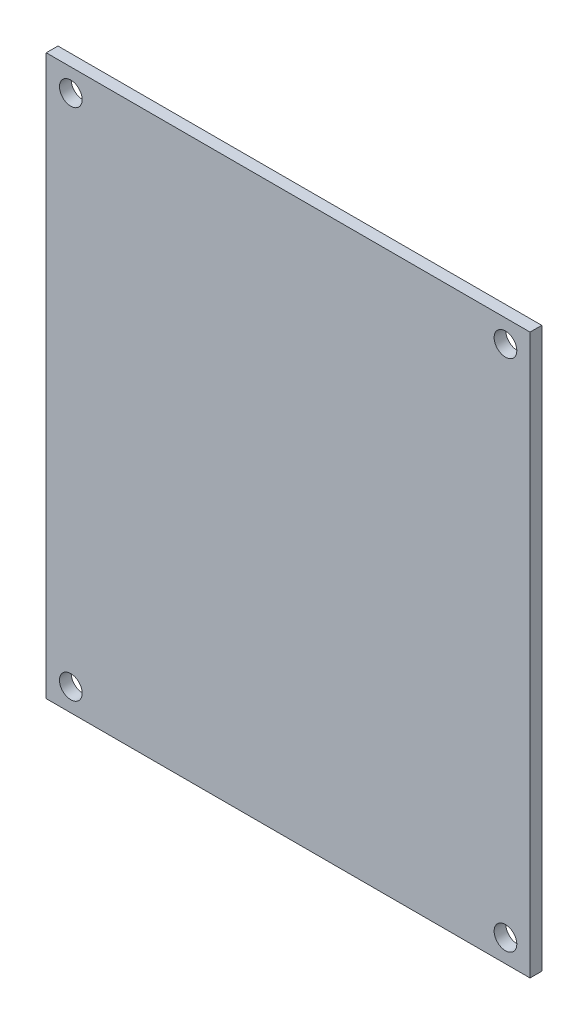
ISO-10303-21;
HEADER;
FILE_DESCRIPTION(('STEP AP214'),'2;1');
FILE_NAME('part.step','',(''),(''),'','','');
FILE_SCHEMA(('AUTOMOTIVE_DESIGN { 1 0 10303 214 1 1 1 1 }'));
ENDSEC;
DATA;
#1=APPLICATION_CONTEXT('core data for automotive mechanical design processes');
#2=APPLICATION_PROTOCOL_DEFINITION('international standard','automotive_design',2000,#1);
#3=PRODUCT_CONTEXT('',#1,'mechanical');
#4=PRODUCT('Part','Part','',(#3));
#5=PRODUCT_RELATED_PRODUCT_CATEGORY('part','',(#4));
#6=PRODUCT_DEFINITION_FORMATION('','',#4);
#7=PRODUCT_DEFINITION_CONTEXT('part definition',#1,'design');
#8=PRODUCT_DEFINITION('design','',#6,#7);
#9=PRODUCT_DEFINITION_SHAPE('','',#8);
#10=(LENGTH_UNIT() NAMED_UNIT(*) SI_UNIT(.MILLI.,.METRE.));
#11=(NAMED_UNIT(*) PLANE_ANGLE_UNIT() SI_UNIT($,.RADIAN.));
#12=(NAMED_UNIT(*) SI_UNIT($,.STERADIAN.) SOLID_ANGLE_UNIT());
#13=UNCERTAINTY_MEASURE_WITH_UNIT(LENGTH_MEASURE(1.E-05),#10,'distance_accuracy_value','');
#14=(GEOMETRIC_REPRESENTATION_CONTEXT(3) GLOBAL_UNCERTAINTY_ASSIGNED_CONTEXT((#13)) GLOBAL_UNIT_ASSIGNED_CONTEXT((#10,
#11,#12)) REPRESENTATION_CONTEXT('',''));
#15=CARTESIAN_POINT('',(0.,0.,0.));
#16=DIRECTION('',(0.,0.,1.));
#17=DIRECTION('',(1.,0.,0.));
#18=AXIS2_PLACEMENT_3D('',#15,#16,#17);
#19=CARTESIAN_POINT('',(32.,-37.,1.55));
#20=DIRECTION('',(-1.,0.,0.));
#21=DIRECTION('',(0.,0.,1.));
#22=AXIS2_PLACEMENT_3D('',#19,#20,#21);
#23=PLANE('',#22);
#24=DIRECTION('',(0.,1.,0.));
#25=VECTOR('',#24,1.);
#26=CARTESIAN_POINT('',(32.,-37.,0.));
#27=LINE('',#26,#25);
#28=CARTESIAN_POINT('',(32.,-37.,0.));
#29=VERTEX_POINT('',#28);
#30=CARTESIAN_POINT('',(32.,37.,0.));
#31=VERTEX_POINT('',#30);
#32=EDGE_CURVE('E97',#29,#31,#27,.T.);
#33=ORIENTED_EDGE('',*,*,#32,.T.);
#34=DIRECTION('',(0.,0.,-1.));
#35=VECTOR('',#34,1.);
#36=CARTESIAN_POINT('',(32.,37.,1.55));
#37=LINE('',#36,#35);
#38=CARTESIAN_POINT('',(32.,37.,1.55));
#39=VERTEX_POINT('',#38);
#40=EDGE_CURVE('E11',#39,#31,#37,.T.);
#41=ORIENTED_EDGE('',*,*,#40,.F.);
#42=DIRECTION('',(0.,1.,0.));
#43=VECTOR('',#42,1.);
#44=CARTESIAN_POINT('',(32.,-37.,1.55));
#45=LINE('',#44,#43);
#46=CARTESIAN_POINT('',(32.,-37.,1.55));
#47=VERTEX_POINT('',#46);
#48=EDGE_CURVE('E85',#47,#39,#45,.T.);
#49=ORIENTED_EDGE('',*,*,#48,.F.);
#50=DIRECTION('',(0.,0.,-1.));
#51=VECTOR('',#50,1.);
#52=CARTESIAN_POINT('',(32.,-37.,1.55));
#53=LINE('',#52,#51);
#54=EDGE_CURVE('E93',#47,#29,#53,.T.);
#55=ORIENTED_EDGE('',*,*,#54,.T.);
#56=EDGE_LOOP('',(#33,#41,#49,#55));
#57=FACE_BOUND('',#56,.T.);
#58=ADVANCED_FACE('F34',(#57),#23,.F.);
#59=CARTESIAN_POINT('',(-32.,37.,1.55));
#60=DIRECTION('',(0.,-1.,0.));
#61=DIRECTION('',(1.,0.,0.));
#62=AXIS2_PLACEMENT_3D('',#59,#60,#61);
#63=PLANE('',#62);
#64=DIRECTION('',(-1.,0.,0.));
#65=VECTOR('',#64,1.);
#66=CARTESIAN_POINT('',(-32.,37.,0.));
#67=LINE('',#66,#65);
#68=CARTESIAN_POINT('',(-32.,37.,0.));
#69=VERTEX_POINT('',#68);
#70=EDGE_CURVE('E89',#31,#69,#67,.T.);
#71=ORIENTED_EDGE('',*,*,#70,.T.);
#72=DIRECTION('',(0.,0.,-1.));
#73=VECTOR('',#72,1.);
#74=CARTESIAN_POINT('',(-32.,37.,1.55));
#75=LINE('',#74,#73);
#76=CARTESIAN_POINT('',(-32.,37.,1.55));
#77=VERTEX_POINT('',#76);
#78=EDGE_CURVE('E42',#77,#69,#75,.T.);
#79=ORIENTED_EDGE('',*,*,#78,.F.);
#80=DIRECTION('',(-1.,0.,0.));
#81=VECTOR('',#80,1.);
#82=CARTESIAN_POINT('',(-32.,37.,1.55));
#83=LINE('',#82,#81);
#84=EDGE_CURVE('E80',#39,#77,#83,.T.);
#85=ORIENTED_EDGE('',*,*,#84,.F.);
#86=ORIENTED_EDGE('',*,*,#40,.T.);
#87=EDGE_LOOP('',(#71,#79,#85,#86));
#88=FACE_BOUND('',#87,.T.);
#89=ADVANCED_FACE('F88',(#88),#63,.F.);
#90=CARTESIAN_POINT('',(-32.,-37.,1.55));
#91=DIRECTION('',(1.,0.,0.));
#92=DIRECTION('',(0.,0.,-1.));
#93=AXIS2_PLACEMENT_3D('',#90,#91,#92);
#94=PLANE('',#93);
#95=DIRECTION('',(0.,-1.,0.));
#96=VECTOR('',#95,1.);
#97=CARTESIAN_POINT('',(-32.,-37.,0.));
#98=LINE('',#97,#96);
#99=CARTESIAN_POINT('',(-32.,-37.,0.));
#100=VERTEX_POINT('',#99);
#101=EDGE_CURVE('E67',#69,#100,#98,.T.);
#102=ORIENTED_EDGE('',*,*,#101,.T.);
#103=DIRECTION('',(0.,0.,-1.));
#104=VECTOR('',#103,1.);
#105=CARTESIAN_POINT('',(-32.,-37.,1.55));
#106=LINE('',#105,#104);
#107=CARTESIAN_POINT('',(-32.,-37.,1.55));
#108=VERTEX_POINT('',#107);
#109=EDGE_CURVE('E90',#108,#100,#106,.T.);
#110=ORIENTED_EDGE('',*,*,#109,.F.);
#111=DIRECTION('',(0.,-1.,0.));
#112=VECTOR('',#111,1.);
#113=CARTESIAN_POINT('',(-32.,-37.,1.55));
#114=LINE('',#113,#112);
#115=EDGE_CURVE('E83',#77,#108,#114,.T.);
#116=ORIENTED_EDGE('',*,*,#115,.F.);
#117=ORIENTED_EDGE('',*,*,#78,.T.);
#118=EDGE_LOOP('',(#102,#110,#116,#117));
#119=FACE_BOUND('',#118,.T.);
#120=ADVANCED_FACE('F91',(#119),#94,.F.);
#121=CARTESIAN_POINT('',(-32.,-37.,1.55));
#122=DIRECTION('',(0.,1.,0.));
#123=DIRECTION('',(-1.,0.,0.));
#124=AXIS2_PLACEMENT_3D('',#121,#122,#123);
#125=PLANE('',#124);
#126=DIRECTION('',(1.,0.,0.));
#127=VECTOR('',#126,1.);
#128=CARTESIAN_POINT('',(-32.,-37.,0.));
#129=LINE('',#128,#127);
#130=EDGE_CURVE('E73',#100,#29,#129,.T.);
#131=ORIENTED_EDGE('',*,*,#130,.T.);
#132=ORIENTED_EDGE('',*,*,#54,.F.);
#133=DIRECTION('',(1.,0.,0.));
#134=VECTOR('',#133,1.);
#135=CARTESIAN_POINT('',(-32.,-37.,1.55));
#136=LINE('',#135,#134);
#137=EDGE_CURVE('E50',#108,#47,#136,.T.);
#138=ORIENTED_EDGE('',*,*,#137,.F.);
#139=ORIENTED_EDGE('',*,*,#109,.T.);
#140=EDGE_LOOP('',(#131,#132,#138,#139));
#141=FACE_BOUND('',#140,.T.);
#142=ADVANCED_FACE('F105',(#141),#125,.F.);
#143=CARTESIAN_POINT('',(0.,0.,1.55));
#144=DIRECTION('',(0.,0.,-1.));
#145=DIRECTION('',(-1.,0.,0.));
#146=AXIS2_PLACEMENT_3D('',#143,#144,#145);
#147=PLANE('',#146);
#148=CARTESIAN_POINT('',(-28.75,-34.,1.55));
#149=DIRECTION('',(0.,0.,1.));
#150=DIRECTION('',(1.,0.,0.));
#151=AXIS2_PLACEMENT_3D('',#148,#149,#150);
#152=CIRCLE('',#151,1.5);
#153=CARTESIAN_POINT('',(-27.25,-34.,1.55));
#154=VERTEX_POINT('',#153);
#155=EDGE_CURVE('E117',#154,#154,#152,.T.);
#156=ORIENTED_EDGE('',*,*,#155,.F.);
#157=EDGE_LOOP('',(#156));
#158=FACE_BOUND('',#157,.T.);
#159=CARTESIAN_POINT('',(28.75,-34.,1.55));
#160=DIRECTION('',(0.,0.,1.));
#161=DIRECTION('',(1.,0.,0.));
#162=AXIS2_PLACEMENT_3D('',#159,#160,#161);
#163=CIRCLE('',#162,1.5);
#164=CARTESIAN_POINT('',(30.25,-34.,1.55));
#165=VERTEX_POINT('',#164);
#166=EDGE_CURVE('E123',#165,#165,#163,.T.);
#167=ORIENTED_EDGE('',*,*,#166,.F.);
#168=EDGE_LOOP('',(#167));
#169=FACE_BOUND('',#168,.T.);
#170=CARTESIAN_POINT('',(28.75,34.,1.55));
#171=DIRECTION('',(0.,0.,1.));
#172=DIRECTION('',(1.,0.,0.));
#173=AXIS2_PLACEMENT_3D('',#170,#171,#172);
#174=CIRCLE('',#173,1.5);
#175=CARTESIAN_POINT('',(30.25,34.,1.55));
#176=VERTEX_POINT('',#175);
#177=EDGE_CURVE('E129',#176,#176,#174,.T.);
#178=ORIENTED_EDGE('',*,*,#177,.F.);
#179=EDGE_LOOP('',(#178));
#180=FACE_BOUND('',#179,.T.);
#181=CARTESIAN_POINT('',(-28.75,34.,1.55));
#182=DIRECTION('',(0.,0.,1.));
#183=DIRECTION('',(1.,0.,0.));
#184=AXIS2_PLACEMENT_3D('',#181,#182,#183);
#185=CIRCLE('',#184,1.5);
#186=CARTESIAN_POINT('',(-27.25,34.,1.55));
#187=VERTEX_POINT('',#186);
#188=EDGE_CURVE('E111',#187,#187,#185,.T.);
#189=ORIENTED_EDGE('',*,*,#188,.F.);
#190=EDGE_LOOP('',(#189));
#191=FACE_BOUND('',#190,.T.);
#192=ORIENTED_EDGE('',*,*,#48,.T.);
#193=ORIENTED_EDGE('',*,*,#84,.T.);
#194=ORIENTED_EDGE('',*,*,#115,.T.);
#195=ORIENTED_EDGE('',*,*,#137,.T.);
#196=EDGE_LOOP('',(#192,#193,#194,#195));
#197=FACE_BOUND('',#196,.T.);
#198=ADVANCED_FACE('F81',(#158,#169,#180,#191,#197),#147,.F.);
#199=CARTESIAN_POINT('',(0.,0.,0.));
#200=DIRECTION('',(0.,0.,-1.));
#201=DIRECTION('',(-1.,0.,0.));
#202=AXIS2_PLACEMENT_3D('',#199,#200,#201);
#203=PLANE('',#202);
#204=CARTESIAN_POINT('',(-28.75,-34.,0.));
#205=DIRECTION('',(0.,0.,1.));
#206=DIRECTION('',(1.,0.,0.));
#207=AXIS2_PLACEMENT_3D('',#204,#205,#206);
#208=CIRCLE('',#207,1.5);
#209=CARTESIAN_POINT('',(-27.25,-34.,0.));
#210=VERTEX_POINT('',#209);
#211=EDGE_CURVE('E120',#210,#210,#208,.T.);
#212=ORIENTED_EDGE('',*,*,#211,.T.);
#213=EDGE_LOOP('',(#212));
#214=FACE_BOUND('',#213,.T.);
#215=CARTESIAN_POINT('',(28.75,-34.,0.));
#216=DIRECTION('',(0.,0.,1.));
#217=DIRECTION('',(1.,0.,0.));
#218=AXIS2_PLACEMENT_3D('',#215,#216,#217);
#219=CIRCLE('',#218,1.5);
#220=CARTESIAN_POINT('',(30.25,-34.,0.));
#221=VERTEX_POINT('',#220);
#222=EDGE_CURVE('E126',#221,#221,#219,.T.);
#223=ORIENTED_EDGE('',*,*,#222,.T.);
#224=EDGE_LOOP('',(#223));
#225=FACE_BOUND('',#224,.T.);
#226=CARTESIAN_POINT('',(28.75,34.,0.));
#227=DIRECTION('',(0.,0.,1.));
#228=DIRECTION('',(1.,0.,0.));
#229=AXIS2_PLACEMENT_3D('',#226,#227,#228);
#230=CIRCLE('',#229,1.5);
#231=CARTESIAN_POINT('',(30.25,34.,0.));
#232=VERTEX_POINT('',#231);
#233=EDGE_CURVE('E114',#232,#232,#230,.T.);
#234=ORIENTED_EDGE('',*,*,#233,.T.);
#235=EDGE_LOOP('',(#234));
#236=FACE_BOUND('',#235,.T.);
#237=CARTESIAN_POINT('',(-28.75,34.,0.));
#238=DIRECTION('',(0.,0.,1.));
#239=DIRECTION('',(1.,0.,0.));
#240=AXIS2_PLACEMENT_3D('',#237,#238,#239);
#241=CIRCLE('',#240,1.5);
#242=CARTESIAN_POINT('',(-27.25,34.,0.));
#243=VERTEX_POINT('',#242);
#244=EDGE_CURVE('E100',#243,#243,#241,.T.);
#245=ORIENTED_EDGE('',*,*,#244,.T.);
#246=EDGE_LOOP('',(#245));
#247=FACE_BOUND('',#246,.T.);
#248=ORIENTED_EDGE('',*,*,#32,.F.);
#249=ORIENTED_EDGE('',*,*,#130,.F.);
#250=ORIENTED_EDGE('',*,*,#101,.F.);
#251=ORIENTED_EDGE('',*,*,#70,.F.);
#252=EDGE_LOOP('',(#248,#249,#250,#251));
#253=FACE_BOUND('',#252,.T.);
#254=ADVANCED_FACE('F108',(#214,#225,#236,#247,#253),#203,.T.);
#255=CARTESIAN_POINT('',(-28.75,34.,0.));
#256=DIRECTION('',(0.,0.,1.));
#257=DIRECTION('',(1.,0.,0.));
#258=AXIS2_PLACEMENT_3D('',#255,#256,#257);
#259=CYLINDRICAL_SURFACE('',#258,1.5);
#260=CARTESIAN_POINT('',(-27.25,34.,0.));
#261=CARTESIAN_POINT('',(-27.25,34.,0.0161458333333333));
#262=CARTESIAN_POINT('',(-27.25,34.,0.0322916666666667));
#263=CARTESIAN_POINT('',(-27.25,34.,0.0645833333333333));
#264=CARTESIAN_POINT('',(-27.25,34.,0.0807291666666667));
#265=CARTESIAN_POINT('',(-27.25,34.,0.113020833333333));
#266=CARTESIAN_POINT('',(-27.25,34.,0.129166666666667));
#267=CARTESIAN_POINT('',(-27.25,34.,0.161458333333333));
#268=CARTESIAN_POINT('',(-27.25,34.,0.177604166666667));
#269=CARTESIAN_POINT('',(-27.25,34.,0.209895833333333));
#270=CARTESIAN_POINT('',(-27.25,34.,0.226041666666667));
#271=CARTESIAN_POINT('',(-27.25,34.,0.258333333333333));
#272=CARTESIAN_POINT('',(-27.25,34.,0.274479166666667));
#273=CARTESIAN_POINT('',(-27.25,34.,0.306770833333333));
#274=CARTESIAN_POINT('',(-27.25,34.,0.322916666666667));
#275=CARTESIAN_POINT('',(-27.25,34.,0.355208333333333));
#276=CARTESIAN_POINT('',(-27.25,34.,0.371354166666667));
#277=CARTESIAN_POINT('',(-27.25,34.,0.403645833333333));
#278=CARTESIAN_POINT('',(-27.25,34.,0.419791666666667));
#279=CARTESIAN_POINT('',(-27.25,34.,0.452083333333333));
#280=CARTESIAN_POINT('',(-27.25,34.,0.468229166666667));
#281=CARTESIAN_POINT('',(-27.25,34.,0.500520833333333));
#282=CARTESIAN_POINT('',(-27.25,34.,0.516666666666667));
#283=CARTESIAN_POINT('',(-27.25,34.,0.548958333333333));
#284=CARTESIAN_POINT('',(-27.25,34.,0.565104166666667));
#285=CARTESIAN_POINT('',(-27.25,34.,0.597395833333333));
#286=CARTESIAN_POINT('',(-27.25,34.,0.613541666666667));
#287=CARTESIAN_POINT('',(-27.25,34.,0.645833333333333));
#288=CARTESIAN_POINT('',(-27.25,34.,0.661979166666667));
#289=CARTESIAN_POINT('',(-27.25,34.,0.694270833333333));
#290=CARTESIAN_POINT('',(-27.25,34.,0.710416666666667));
#291=CARTESIAN_POINT('',(-27.25,34.,0.742708333333333));
#292=CARTESIAN_POINT('',(-27.25,34.,0.758854166666667));
#293=CARTESIAN_POINT('',(-27.25,34.,0.791145833333333));
#294=CARTESIAN_POINT('',(-27.25,34.,0.807291666666667));
#295=CARTESIAN_POINT('',(-27.25,34.,0.839583333333333));
#296=CARTESIAN_POINT('',(-27.25,34.,0.855729166666667));
#297=CARTESIAN_POINT('',(-27.25,34.,0.888020833333333));
#298=CARTESIAN_POINT('',(-27.25,34.,0.904166666666667));
#299=CARTESIAN_POINT('',(-27.25,34.,0.936458333333333));
#300=CARTESIAN_POINT('',(-27.25,34.,0.952604166666667));
#301=CARTESIAN_POINT('',(-27.25,34.,0.984895833333333));
#302=CARTESIAN_POINT('',(-27.25,34.,1.00104166666667));
#303=CARTESIAN_POINT('',(-27.25,34.,1.03333333333333));
#304=CARTESIAN_POINT('',(-27.25,34.,1.04947916666667));
#305=CARTESIAN_POINT('',(-27.25,34.,1.08177083333333));
#306=CARTESIAN_POINT('',(-27.25,34.,1.09791666666667));
#307=CARTESIAN_POINT('',(-27.25,34.,1.13020833333333));
#308=CARTESIAN_POINT('',(-27.25,34.,1.14635416666667));
#309=CARTESIAN_POINT('',(-27.25,34.,1.17864583333333));
#310=CARTESIAN_POINT('',(-27.25,34.,1.19479166666667));
#311=CARTESIAN_POINT('',(-27.25,34.,1.22708333333333));
#312=CARTESIAN_POINT('',(-27.25,34.,1.24322916666667));
#313=CARTESIAN_POINT('',(-27.25,34.,1.27552083333333));
#314=CARTESIAN_POINT('',(-27.25,34.,1.29166666666667));
#315=CARTESIAN_POINT('',(-27.25,34.,1.32395833333333));
#316=CARTESIAN_POINT('',(-27.25,34.,1.34010416666667));
#317=CARTESIAN_POINT('',(-27.25,34.,1.37239583333333));
#318=CARTESIAN_POINT('',(-27.25,34.,1.38854166666667));
#319=CARTESIAN_POINT('',(-27.25,34.,1.42083333333333));
#320=CARTESIAN_POINT('',(-27.25,34.,1.43697916666667));
#321=CARTESIAN_POINT('',(-27.25,34.,1.46927083333333));
#322=CARTESIAN_POINT('',(-27.25,34.,1.48541666666667));
#323=CARTESIAN_POINT('',(-27.25,34.,1.51770833333333));
#324=CARTESIAN_POINT('',(-27.25,34.,1.53385416666667));
#325=CARTESIAN_POINT('',(-27.25,34.,1.55));
#326=B_SPLINE_CURVE_WITH_KNOTS('',3,(#260,#261,#262,#263,#264,#265,#266,#267,#268,#269,#270,
#271,#272,#273,#274,#275,#276,#277,#278,#279,#280,#281,#282,#283,#284,#285,#286,#287,#288,#289,
#290,#291,#292,#293,#294,#295,#296,#297,#298,#299,#300,#301,#302,#303,#304,#305,#306,#307,#308,
#309,#310,#311,#312,#313,#314,#315,#316,#317,#318,#319,#320,#321,#322,#323,#324,#325),
.UNSPECIFIED.,.F.,.F.,(4,2,2,2,2,2,2,2,2,2,2,2,2,2,2,2,2,2,2,2,2,2,2,2,2,2,2,2,2,2,2,2,4),(0.,
0.0484375,0.096875,0.1453125,0.19375,0.2421875,0.290625,0.3390625,0.3875,0.4359375,0.484375,
0.5328125,0.58125,0.6296875,0.678125,0.7265625,0.775,0.8234375,0.871875,0.9203125,0.96875,
1.0171875,1.065625,1.1140625,1.1625,1.2109375,1.259375,1.3078125,1.35625,1.4046875,1.453125,
1.5015625,1.55),.UNSPECIFIED.);
#327=EDGE_CURVE('BSEAM141',#243,#187,#326,.T.);
#328=ORIENTED_EDGE('',*,*,#244,.F.);
#329=ORIENTED_EDGE('',*,*,#188,.T.);
#330=ORIENTED_EDGE('',*,*,#327,.T.);
#331=ORIENTED_EDGE('',*,*,#327,.F.);
#332=EDGE_LOOP('',(#328,#330,#329,#331));
#333=FACE_BOUND('',#332,.T.);
#334=ADVANCED_FACE('F141',(#333),#259,.F.);
#335=CARTESIAN_POINT('',(28.75,34.,0.));
#336=DIRECTION('',(0.,0.,1.));
#337=DIRECTION('',(1.,0.,0.));
#338=AXIS2_PLACEMENT_3D('',#335,#336,#337);
#339=CYLINDRICAL_SURFACE('',#338,1.5);
#340=CARTESIAN_POINT('',(30.25,34.,0.));
#341=CARTESIAN_POINT('',(30.25,34.,0.0161458333333333));
#342=CARTESIAN_POINT('',(30.25,34.,0.0322916666666667));
#343=CARTESIAN_POINT('',(30.25,34.,0.0645833333333333));
#344=CARTESIAN_POINT('',(30.25,34.,0.0807291666666667));
#345=CARTESIAN_POINT('',(30.25,34.,0.113020833333333));
#346=CARTESIAN_POINT('',(30.25,34.,0.129166666666667));
#347=CARTESIAN_POINT('',(30.25,34.,0.161458333333333));
#348=CARTESIAN_POINT('',(30.25,34.,0.177604166666667));
#349=CARTESIAN_POINT('',(30.25,34.,0.209895833333333));
#350=CARTESIAN_POINT('',(30.25,34.,0.226041666666667));
#351=CARTESIAN_POINT('',(30.25,34.,0.258333333333333));
#352=CARTESIAN_POINT('',(30.25,34.,0.274479166666667));
#353=CARTESIAN_POINT('',(30.25,34.,0.306770833333333));
#354=CARTESIAN_POINT('',(30.25,34.,0.322916666666667));
#355=CARTESIAN_POINT('',(30.25,34.,0.355208333333333));
#356=CARTESIAN_POINT('',(30.25,34.,0.371354166666667));
#357=CARTESIAN_POINT('',(30.25,34.,0.403645833333333));
#358=CARTESIAN_POINT('',(30.25,34.,0.419791666666667));
#359=CARTESIAN_POINT('',(30.25,34.,0.452083333333333));
#360=CARTESIAN_POINT('',(30.25,34.,0.468229166666667));
#361=CARTESIAN_POINT('',(30.25,34.,0.500520833333333));
#362=CARTESIAN_POINT('',(30.25,34.,0.516666666666667));
#363=CARTESIAN_POINT('',(30.25,34.,0.548958333333333));
#364=CARTESIAN_POINT('',(30.25,34.,0.565104166666667));
#365=CARTESIAN_POINT('',(30.25,34.,0.597395833333333));
#366=CARTESIAN_POINT('',(30.25,34.,0.613541666666667));
#367=CARTESIAN_POINT('',(30.25,34.,0.645833333333333));
#368=CARTESIAN_POINT('',(30.25,34.,0.661979166666667));
#369=CARTESIAN_POINT('',(30.25,34.,0.694270833333333));
#370=CARTESIAN_POINT('',(30.25,34.,0.710416666666667));
#371=CARTESIAN_POINT('',(30.25,34.,0.742708333333333));
#372=CARTESIAN_POINT('',(30.25,34.,0.758854166666667));
#373=CARTESIAN_POINT('',(30.25,34.,0.791145833333333));
#374=CARTESIAN_POINT('',(30.25,34.,0.807291666666667));
#375=CARTESIAN_POINT('',(30.25,34.,0.839583333333333));
#376=CARTESIAN_POINT('',(30.25,34.,0.855729166666667));
#377=CARTESIAN_POINT('',(30.25,34.,0.888020833333333));
#378=CARTESIAN_POINT('',(30.25,34.,0.904166666666667));
#379=CARTESIAN_POINT('',(30.25,34.,0.936458333333333));
#380=CARTESIAN_POINT('',(30.25,34.,0.952604166666667));
#381=CARTESIAN_POINT('',(30.25,34.,0.984895833333333));
#382=CARTESIAN_POINT('',(30.25,34.,1.00104166666667));
#383=CARTESIAN_POINT('',(30.25,34.,1.03333333333333));
#384=CARTESIAN_POINT('',(30.25,34.,1.04947916666667));
#385=CARTESIAN_POINT('',(30.25,34.,1.08177083333333));
#386=CARTESIAN_POINT('',(30.25,34.,1.09791666666667));
#387=CARTESIAN_POINT('',(30.25,34.,1.13020833333333));
#388=CARTESIAN_POINT('',(30.25,34.,1.14635416666667));
#389=CARTESIAN_POINT('',(30.25,34.,1.17864583333333));
#390=CARTESIAN_POINT('',(30.25,34.,1.19479166666667));
#391=CARTESIAN_POINT('',(30.25,34.,1.22708333333333));
#392=CARTESIAN_POINT('',(30.25,34.,1.24322916666667));
#393=CARTESIAN_POINT('',(30.25,34.,1.27552083333333));
#394=CARTESIAN_POINT('',(30.25,34.,1.29166666666667));
#395=CARTESIAN_POINT('',(30.25,34.,1.32395833333333));
#396=CARTESIAN_POINT('',(30.25,34.,1.34010416666667));
#397=CARTESIAN_POINT('',(30.25,34.,1.37239583333333));
#398=CARTESIAN_POINT('',(30.25,34.,1.38854166666667));
#399=CARTESIAN_POINT('',(30.25,34.,1.42083333333333));
#400=CARTESIAN_POINT('',(30.25,34.,1.43697916666667));
#401=CARTESIAN_POINT('',(30.25,34.,1.46927083333333));
#402=CARTESIAN_POINT('',(30.25,34.,1.48541666666667));
#403=CARTESIAN_POINT('',(30.25,34.,1.51770833333333));
#404=CARTESIAN_POINT('',(30.25,34.,1.53385416666667));
#405=CARTESIAN_POINT('',(30.25,34.,1.55));
#406=B_SPLINE_CURVE_WITH_KNOTS('',3,(#340,#341,#342,#343,#344,#345,#346,#347,#348,#349,#350,
#351,#352,#353,#354,#355,#356,#357,#358,#359,#360,#361,#362,#363,#364,#365,#366,#367,#368,#369,
#370,#371,#372,#373,#374,#375,#376,#377,#378,#379,#380,#381,#382,#383,#384,#385,#386,#387,#388,
#389,#390,#391,#392,#393,#394,#395,#396,#397,#398,#399,#400,#401,#402,#403,#404,#405),
.UNSPECIFIED.,.F.,.F.,(4,2,2,2,2,2,2,2,2,2,2,2,2,2,2,2,2,2,2,2,2,2,2,2,2,2,2,2,2,2,2,2,4),(0.,
0.0484375,0.096875,0.1453125,0.19375,0.2421875,0.290625,0.3390625,0.3875,0.4359375,0.484375,
0.5328125,0.58125,0.6296875,0.678125,0.7265625,0.775,0.8234375,0.871875,0.9203125,0.96875,
1.0171875,1.065625,1.1140625,1.1625,1.2109375,1.259375,1.3078125,1.35625,1.4046875,1.453125,
1.5015625,1.55),.UNSPECIFIED.);
#407=EDGE_CURVE('BSEAM137',#232,#176,#406,.T.);
#408=ORIENTED_EDGE('',*,*,#233,.F.);
#409=ORIENTED_EDGE('',*,*,#177,.T.);
#410=ORIENTED_EDGE('',*,*,#407,.T.);
#411=ORIENTED_EDGE('',*,*,#407,.F.);
#412=EDGE_LOOP('',(#408,#410,#409,#411));
#413=FACE_BOUND('',#412,.T.);
#414=ADVANCED_FACE('F137',(#413),#339,.F.);
#415=CARTESIAN_POINT('',(28.75,-34.,0.));
#416=DIRECTION('',(0.,0.,1.));
#417=DIRECTION('',(1.,0.,0.));
#418=AXIS2_PLACEMENT_3D('',#415,#416,#417);
#419=CYLINDRICAL_SURFACE('',#418,1.5);
#420=CARTESIAN_POINT('',(30.25,-34.,0.));
#421=CARTESIAN_POINT('',(30.25,-34.,0.0161458333333333));
#422=CARTESIAN_POINT('',(30.25,-34.,0.0322916666666667));
#423=CARTESIAN_POINT('',(30.25,-34.,0.0645833333333333));
#424=CARTESIAN_POINT('',(30.25,-34.,0.0807291666666667));
#425=CARTESIAN_POINT('',(30.25,-34.,0.113020833333333));
#426=CARTESIAN_POINT('',(30.25,-34.,0.129166666666667));
#427=CARTESIAN_POINT('',(30.25,-34.,0.161458333333333));
#428=CARTESIAN_POINT('',(30.25,-34.,0.177604166666667));
#429=CARTESIAN_POINT('',(30.25,-34.,0.209895833333333));
#430=CARTESIAN_POINT('',(30.25,-34.,0.226041666666667));
#431=CARTESIAN_POINT('',(30.25,-34.,0.258333333333333));
#432=CARTESIAN_POINT('',(30.25,-34.,0.274479166666667));
#433=CARTESIAN_POINT('',(30.25,-34.,0.306770833333333));
#434=CARTESIAN_POINT('',(30.25,-34.,0.322916666666667));
#435=CARTESIAN_POINT('',(30.25,-34.,0.355208333333333));
#436=CARTESIAN_POINT('',(30.25,-34.,0.371354166666667));
#437=CARTESIAN_POINT('',(30.25,-34.,0.403645833333333));
#438=CARTESIAN_POINT('',(30.25,-34.,0.419791666666667));
#439=CARTESIAN_POINT('',(30.25,-34.,0.452083333333333));
#440=CARTESIAN_POINT('',(30.25,-34.,0.468229166666667));
#441=CARTESIAN_POINT('',(30.25,-34.,0.500520833333333));
#442=CARTESIAN_POINT('',(30.25,-34.,0.516666666666667));
#443=CARTESIAN_POINT('',(30.25,-34.,0.548958333333333));
#444=CARTESIAN_POINT('',(30.25,-34.,0.565104166666667));
#445=CARTESIAN_POINT('',(30.25,-34.,0.597395833333333));
#446=CARTESIAN_POINT('',(30.25,-34.,0.613541666666667));
#447=CARTESIAN_POINT('',(30.25,-34.,0.645833333333333));
#448=CARTESIAN_POINT('',(30.25,-34.,0.661979166666667));
#449=CARTESIAN_POINT('',(30.25,-34.,0.694270833333333));
#450=CARTESIAN_POINT('',(30.25,-34.,0.710416666666667));
#451=CARTESIAN_POINT('',(30.25,-34.,0.742708333333333));
#452=CARTESIAN_POINT('',(30.25,-34.,0.758854166666667));
#453=CARTESIAN_POINT('',(30.25,-34.,0.791145833333333));
#454=CARTESIAN_POINT('',(30.25,-34.,0.807291666666667));
#455=CARTESIAN_POINT('',(30.25,-34.,0.839583333333333));
#456=CARTESIAN_POINT('',(30.25,-34.,0.855729166666667));
#457=CARTESIAN_POINT('',(30.25,-34.,0.888020833333333));
#458=CARTESIAN_POINT('',(30.25,-34.,0.904166666666667));
#459=CARTESIAN_POINT('',(30.25,-34.,0.936458333333333));
#460=CARTESIAN_POINT('',(30.25,-34.,0.952604166666667));
#461=CARTESIAN_POINT('',(30.25,-34.,0.984895833333333));
#462=CARTESIAN_POINT('',(30.25,-34.,1.00104166666667));
#463=CARTESIAN_POINT('',(30.25,-34.,1.03333333333333));
#464=CARTESIAN_POINT('',(30.25,-34.,1.04947916666667));
#465=CARTESIAN_POINT('',(30.25,-34.,1.08177083333333));
#466=CARTESIAN_POINT('',(30.25,-34.,1.09791666666667));
#467=CARTESIAN_POINT('',(30.25,-34.,1.13020833333333));
#468=CARTESIAN_POINT('',(30.25,-34.,1.14635416666667));
#469=CARTESIAN_POINT('',(30.25,-34.,1.17864583333333));
#470=CARTESIAN_POINT('',(30.25,-34.,1.19479166666667));
#471=CARTESIAN_POINT('',(30.25,-34.,1.22708333333333));
#472=CARTESIAN_POINT('',(30.25,-34.,1.24322916666667));
#473=CARTESIAN_POINT('',(30.25,-34.,1.27552083333333));
#474=CARTESIAN_POINT('',(30.25,-34.,1.29166666666667));
#475=CARTESIAN_POINT('',(30.25,-34.,1.32395833333333));
#476=CARTESIAN_POINT('',(30.25,-34.,1.34010416666667));
#477=CARTESIAN_POINT('',(30.25,-34.,1.37239583333333));
#478=CARTESIAN_POINT('',(30.25,-34.,1.38854166666667));
#479=CARTESIAN_POINT('',(30.25,-34.,1.42083333333333));
#480=CARTESIAN_POINT('',(30.25,-34.,1.43697916666667));
#481=CARTESIAN_POINT('',(30.25,-34.,1.46927083333333));
#482=CARTESIAN_POINT('',(30.25,-34.,1.48541666666667));
#483=CARTESIAN_POINT('',(30.25,-34.,1.51770833333333));
#484=CARTESIAN_POINT('',(30.25,-34.,1.53385416666667));
#485=CARTESIAN_POINT('',(30.25,-34.,1.55));
#486=B_SPLINE_CURVE_WITH_KNOTS('',3,(#420,#421,#422,#423,#424,#425,#426,#427,#428,#429,#430,
#431,#432,#433,#434,#435,#436,#437,#438,#439,#440,#441,#442,#443,#444,#445,#446,#447,#448,#449,
#450,#451,#452,#453,#454,#455,#456,#457,#458,#459,#460,#461,#462,#463,#464,#465,#466,#467,#468,
#469,#470,#471,#472,#473,#474,#475,#476,#477,#478,#479,#480,#481,#482,#483,#484,#485),
.UNSPECIFIED.,.F.,.F.,(4,2,2,2,2,2,2,2,2,2,2,2,2,2,2,2,2,2,2,2,2,2,2,2,2,2,2,2,2,2,2,2,4),(0.,
0.0484375,0.096875,0.1453125,0.19375,0.2421875,0.290625,0.3390625,0.3875,0.4359375,0.484375,
0.5328125,0.58125,0.6296875,0.678125,0.7265625,0.775,0.8234375,0.871875,0.9203125,0.96875,
1.0171875,1.065625,1.1140625,1.1625,1.2109375,1.259375,1.3078125,1.35625,1.4046875,1.453125,
1.5015625,1.55),.UNSPECIFIED.);
#487=EDGE_CURVE('BSEAM140',#221,#165,#486,.T.);
#488=ORIENTED_EDGE('',*,*,#222,.F.);
#489=ORIENTED_EDGE('',*,*,#166,.T.);
#490=ORIENTED_EDGE('',*,*,#487,.T.);
#491=ORIENTED_EDGE('',*,*,#487,.F.);
#492=EDGE_LOOP('',(#488,#490,#489,#491));
#493=FACE_BOUND('',#492,.T.);
#494=ADVANCED_FACE('F140',(#493),#419,.F.);
#495=CARTESIAN_POINT('',(-28.75,-34.,0.));
#496=DIRECTION('',(0.,0.,1.));
#497=DIRECTION('',(1.,0.,0.));
#498=AXIS2_PLACEMENT_3D('',#495,#496,#497);
#499=CYLINDRICAL_SURFACE('',#498,1.5);
#500=CARTESIAN_POINT('',(-27.25,-34.,0.));
#501=CARTESIAN_POINT('',(-27.25,-34.,0.0161458333333333));
#502=CARTESIAN_POINT('',(-27.25,-34.,0.0322916666666667));
#503=CARTESIAN_POINT('',(-27.25,-34.,0.0645833333333333));
#504=CARTESIAN_POINT('',(-27.25,-34.,0.0807291666666667));
#505=CARTESIAN_POINT('',(-27.25,-34.,0.113020833333333));
#506=CARTESIAN_POINT('',(-27.25,-34.,0.129166666666667));
#507=CARTESIAN_POINT('',(-27.25,-34.,0.161458333333333));
#508=CARTESIAN_POINT('',(-27.25,-34.,0.177604166666667));
#509=CARTESIAN_POINT('',(-27.25,-34.,0.209895833333333));
#510=CARTESIAN_POINT('',(-27.25,-34.,0.226041666666667));
#511=CARTESIAN_POINT('',(-27.25,-34.,0.258333333333333));
#512=CARTESIAN_POINT('',(-27.25,-34.,0.274479166666667));
#513=CARTESIAN_POINT('',(-27.25,-34.,0.306770833333333));
#514=CARTESIAN_POINT('',(-27.25,-34.,0.322916666666667));
#515=CARTESIAN_POINT('',(-27.25,-34.,0.355208333333333));
#516=CARTESIAN_POINT('',(-27.25,-34.,0.371354166666667));
#517=CARTESIAN_POINT('',(-27.25,-34.,0.403645833333333));
#518=CARTESIAN_POINT('',(-27.25,-34.,0.419791666666667));
#519=CARTESIAN_POINT('',(-27.25,-34.,0.452083333333333));
#520=CARTESIAN_POINT('',(-27.25,-34.,0.468229166666667));
#521=CARTESIAN_POINT('',(-27.25,-34.,0.500520833333333));
#522=CARTESIAN_POINT('',(-27.25,-34.,0.516666666666667));
#523=CARTESIAN_POINT('',(-27.25,-34.,0.548958333333333));
#524=CARTESIAN_POINT('',(-27.25,-34.,0.565104166666667));
#525=CARTESIAN_POINT('',(-27.25,-34.,0.597395833333333));
#526=CARTESIAN_POINT('',(-27.25,-34.,0.613541666666667));
#527=CARTESIAN_POINT('',(-27.25,-34.,0.645833333333333));
#528=CARTESIAN_POINT('',(-27.25,-34.,0.661979166666667));
#529=CARTESIAN_POINT('',(-27.25,-34.,0.694270833333333));
#530=CARTESIAN_POINT('',(-27.25,-34.,0.710416666666667));
#531=CARTESIAN_POINT('',(-27.25,-34.,0.742708333333333));
#532=CARTESIAN_POINT('',(-27.25,-34.,0.758854166666667));
#533=CARTESIAN_POINT('',(-27.25,-34.,0.791145833333333));
#534=CARTESIAN_POINT('',(-27.25,-34.,0.807291666666667));
#535=CARTESIAN_POINT('',(-27.25,-34.,0.839583333333333));
#536=CARTESIAN_POINT('',(-27.25,-34.,0.855729166666667));
#537=CARTESIAN_POINT('',(-27.25,-34.,0.888020833333333));
#538=CARTESIAN_POINT('',(-27.25,-34.,0.904166666666667));
#539=CARTESIAN_POINT('',(-27.25,-34.,0.936458333333333));
#540=CARTESIAN_POINT('',(-27.25,-34.,0.952604166666667));
#541=CARTESIAN_POINT('',(-27.25,-34.,0.984895833333333));
#542=CARTESIAN_POINT('',(-27.25,-34.,1.00104166666667));
#543=CARTESIAN_POINT('',(-27.25,-34.,1.03333333333333));
#544=CARTESIAN_POINT('',(-27.25,-34.,1.04947916666667));
#545=CARTESIAN_POINT('',(-27.25,-34.,1.08177083333333));
#546=CARTESIAN_POINT('',(-27.25,-34.,1.09791666666667));
#547=CARTESIAN_POINT('',(-27.25,-34.,1.13020833333333));
#548=CARTESIAN_POINT('',(-27.25,-34.,1.14635416666667));
#549=CARTESIAN_POINT('',(-27.25,-34.,1.17864583333333));
#550=CARTESIAN_POINT('',(-27.25,-34.,1.19479166666667));
#551=CARTESIAN_POINT('',(-27.25,-34.,1.22708333333333));
#552=CARTESIAN_POINT('',(-27.25,-34.,1.24322916666667));
#553=CARTESIAN_POINT('',(-27.25,-34.,1.27552083333333));
#554=CARTESIAN_POINT('',(-27.25,-34.,1.29166666666667));
#555=CARTESIAN_POINT('',(-27.25,-34.,1.32395833333333));
#556=CARTESIAN_POINT('',(-27.25,-34.,1.34010416666667));
#557=CARTESIAN_POINT('',(-27.25,-34.,1.37239583333333));
#558=CARTESIAN_POINT('',(-27.25,-34.,1.38854166666667));
#559=CARTESIAN_POINT('',(-27.25,-34.,1.42083333333333));
#560=CARTESIAN_POINT('',(-27.25,-34.,1.43697916666667));
#561=CARTESIAN_POINT('',(-27.25,-34.,1.46927083333333));
#562=CARTESIAN_POINT('',(-27.25,-34.,1.48541666666667));
#563=CARTESIAN_POINT('',(-27.25,-34.,1.51770833333333));
#564=CARTESIAN_POINT('',(-27.25,-34.,1.53385416666667));
#565=CARTESIAN_POINT('',(-27.25,-34.,1.55));
#566=B_SPLINE_CURVE_WITH_KNOTS('',3,(#500,#501,#502,#503,#504,#505,#506,#507,#508,#509,#510,
#511,#512,#513,#514,#515,#516,#517,#518,#519,#520,#521,#522,#523,#524,#525,#526,#527,#528,#529,
#530,#531,#532,#533,#534,#535,#536,#537,#538,#539,#540,#541,#542,#543,#544,#545,#546,#547,#548,
#549,#550,#551,#552,#553,#554,#555,#556,#557,#558,#559,#560,#561,#562,#563,#564,#565),
.UNSPECIFIED.,.F.,.F.,(4,2,2,2,2,2,2,2,2,2,2,2,2,2,2,2,2,2,2,2,2,2,2,2,2,2,2,2,2,2,2,2,4),(0.,
0.0484375,0.096875,0.1453125,0.19375,0.2421875,0.290625,0.3390625,0.3875,0.4359375,0.484375,
0.5328125,0.58125,0.6296875,0.678125,0.7265625,0.775,0.8234375,0.871875,0.9203125,0.96875,
1.0171875,1.065625,1.1140625,1.1625,1.2109375,1.259375,1.3078125,1.35625,1.4046875,1.453125,
1.5015625,1.55),.UNSPECIFIED.);
#567=EDGE_CURVE('BSEAM202',#210,#154,#566,.T.);
#568=ORIENTED_EDGE('',*,*,#211,.F.);
#569=ORIENTED_EDGE('',*,*,#155,.T.);
#570=ORIENTED_EDGE('',*,*,#567,.T.);
#571=ORIENTED_EDGE('',*,*,#567,.F.);
#572=EDGE_LOOP('',(#568,#570,#569,#571));
#573=FACE_BOUND('',#572,.T.);
#574=ADVANCED_FACE('F202',(#573),#499,.F.);
#575=CLOSED_SHELL('',(#58,#89,#120,#142,#198,#254,#334,#414,#494,#574));
#576=MANIFOLD_SOLID_BREP('B2',#575);
#577=ADVANCED_BREP_SHAPE_REPRESENTATION('',(#18,#576),#14);
#578=SHAPE_DEFINITION_REPRESENTATION(#9,#577);
ENDSEC;
END-ISO-10303-21;
